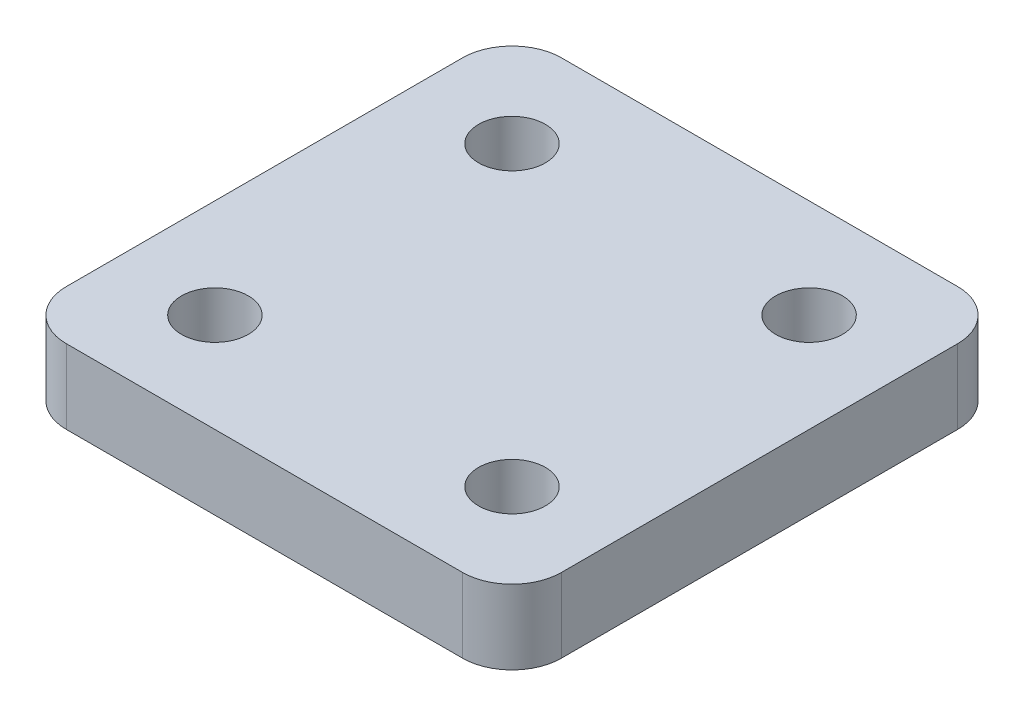
ISO-10303-21;
HEADER;
FILE_DESCRIPTION(('STEP AP214'),'2;1');
FILE_NAME('part.step','',(''),(''),'','','');
FILE_SCHEMA(('AUTOMOTIVE_DESIGN { 1 0 10303 214 1 1 1 1 }'));
ENDSEC;
DATA;
#1=APPLICATION_CONTEXT('core data for automotive mechanical design processes');
#2=APPLICATION_PROTOCOL_DEFINITION('international standard','automotive_design',2000,#1);
#3=PRODUCT_CONTEXT('',#1,'mechanical');
#4=PRODUCT('Part','Part','',(#3));
#5=PRODUCT_RELATED_PRODUCT_CATEGORY('part','',(#4));
#6=PRODUCT_DEFINITION_FORMATION('','',#4);
#7=PRODUCT_DEFINITION_CONTEXT('part definition',#1,'design');
#8=PRODUCT_DEFINITION('design','',#6,#7);
#9=PRODUCT_DEFINITION_SHAPE('','',#8);
#10=(LENGTH_UNIT() NAMED_UNIT(*) SI_UNIT(.MILLI.,.METRE.));
#11=(NAMED_UNIT(*) PLANE_ANGLE_UNIT() SI_UNIT($,.RADIAN.));
#12=(NAMED_UNIT(*) SI_UNIT($,.STERADIAN.) SOLID_ANGLE_UNIT());
#13=UNCERTAINTY_MEASURE_WITH_UNIT(LENGTH_MEASURE(1.E-05),#10,'distance_accuracy_value','');
#14=(GEOMETRIC_REPRESENTATION_CONTEXT(3) GLOBAL_UNCERTAINTY_ASSIGNED_CONTEXT((#13)) GLOBAL_UNIT_ASSIGNED_CONTEXT((#10,
#11,#12)) REPRESENTATION_CONTEXT('',''));
#15=CARTESIAN_POINT('',(0.,0.,0.));
#16=DIRECTION('',(0.,0.,1.));
#17=DIRECTION('',(1.,0.,0.));
#18=AXIS2_PLACEMENT_3D('',#15,#16,#17);
#19=CARTESIAN_POINT('',(0.,3.,0.));
#20=DIRECTION('',(0.,-1.,0.));
#21=DIRECTION('',(0.,0.,1.));
#22=AXIS2_PLACEMENT_3D('',#19,#20,#21);
#23=PLANE('',#22);
#24=DIRECTION('',(0.,0.,-1.));
#25=VECTOR('',#24,1.);
#26=CARTESIAN_POINT('',(-10.,3.,-10.));
#27=LINE('',#26,#25);
#28=CARTESIAN_POINT('',(-9.99999999999999,3.,8.));
#29=VERTEX_POINT('',#28);
#30=CARTESIAN_POINT('',(-10.,3.,-8.));
#31=VERTEX_POINT('',#30);
#32=EDGE_CURVE('E202',#29,#31,#27,.T.);
#33=ORIENTED_EDGE('',*,*,#32,.F.);
#34=CARTESIAN_POINT('',(-7.99999999999999,3.,8.));
#35=DIRECTION('',(0.,1.,0.));
#36=DIRECTION('',(0.,0.,1.));
#37=AXIS2_PLACEMENT_3D('',#34,#35,#36);
#38=CIRCLE('',#37,2.);
#39=CARTESIAN_POINT('',(-7.99999999999999,3.,10.));
#40=VERTEX_POINT('',#39);
#41=EDGE_CURVE('E164',#40,#29,#38,.F.);
#42=ORIENTED_EDGE('',*,*,#41,.F.);
#43=DIRECTION('',(-1.,0.,0.));
#44=VECTOR('',#43,1.);
#45=CARTESIAN_POINT('',(-9.99999999999999,3.,10.));
#46=LINE('',#45,#44);
#47=CARTESIAN_POINT('',(8.,3.,10.));
#48=VERTEX_POINT('',#47);
#49=EDGE_CURVE('E136',#48,#40,#46,.T.);
#50=ORIENTED_EDGE('',*,*,#49,.F.);
#51=CARTESIAN_POINT('',(8.,3.,8.00000000000001));
#52=DIRECTION('',(0.,1.,0.));
#53=DIRECTION('',(0.,0.,1.));
#54=AXIS2_PLACEMENT_3D('',#51,#52,#53);
#55=CIRCLE('',#54,2.);
#56=CARTESIAN_POINT('',(10.,3.,8.));
#57=VERTEX_POINT('',#56);
#58=EDGE_CURVE('E162',#57,#48,#55,.F.);
#59=ORIENTED_EDGE('',*,*,#58,.F.);
#60=DIRECTION('',(0.,0.,1.));
#61=VECTOR('',#60,1.);
#62=CARTESIAN_POINT('',(10.,3.,-10.));
#63=LINE('',#62,#61);
#64=CARTESIAN_POINT('',(10.,3.,-8.));
#65=VERTEX_POINT('',#64);
#66=EDGE_CURVE('E133',#65,#57,#63,.T.);
#67=ORIENTED_EDGE('',*,*,#66,.F.);
#68=CARTESIAN_POINT('',(8.,3.,-8.));
#69=DIRECTION('',(0.,1.,0.));
#70=DIRECTION('',(0.,0.,1.));
#71=AXIS2_PLACEMENT_3D('',#68,#69,#70);
#72=CIRCLE('',#71,2.);
#73=CARTESIAN_POINT('',(8.00000000000001,3.,-10.));
#74=VERTEX_POINT('',#73);
#75=EDGE_CURVE('E159',#74,#65,#72,.F.);
#76=ORIENTED_EDGE('',*,*,#75,.F.);
#77=DIRECTION('',(1.,0.,0.));
#78=VECTOR('',#77,1.);
#79=CARTESIAN_POINT('',(-10.,3.,-10.));
#80=LINE('',#79,#78);
#81=CARTESIAN_POINT('',(-8.,3.,-10.));
#82=VERTEX_POINT('',#81);
#83=EDGE_CURVE('E205',#82,#74,#80,.T.);
#84=ORIENTED_EDGE('',*,*,#83,.F.);
#85=CARTESIAN_POINT('',(-8.,3.,-8.));
#86=DIRECTION('',(0.,1.,0.));
#87=DIRECTION('',(0.,0.,1.));
#88=AXIS2_PLACEMENT_3D('',#85,#86,#87);
#89=CIRCLE('',#88,2.);
#90=EDGE_CURVE('E111',#31,#82,#89,.F.);
#91=ORIENTED_EDGE('',*,*,#90,.F.);
#92=EDGE_LOOP('',(#33,#42,#50,#59,#67,#76,#84,#91));
#93=FACE_BOUND('',#92,.T.);
#94=CARTESIAN_POINT('',(-6.,3.,6.));
#95=DIRECTION('',(0.,-1.,0.));
#96=DIRECTION('',(0.,0.,-1.));
#97=AXIS2_PLACEMENT_3D('',#94,#95,#96);
#98=CIRCLE('',#97,1.35);
#99=CARTESIAN_POINT('',(-6.,3.,4.65));
#100=VERTEX_POINT('',#99);
#101=EDGE_CURVE('E178',#100,#100,#98,.T.);
#102=ORIENTED_EDGE('',*,*,#101,.T.);
#103=EDGE_LOOP('',(#102));
#104=FACE_BOUND('',#103,.T.);
#105=CARTESIAN_POINT('',(6.,3.,6.));
#106=DIRECTION('',(0.,-1.,0.));
#107=DIRECTION('',(0.,0.,1.));
#108=AXIS2_PLACEMENT_3D('',#105,#106,#107);
#109=CIRCLE('',#108,1.35);
#110=CARTESIAN_POINT('',(6.,3.,7.35));
#111=VERTEX_POINT('',#110);
#112=EDGE_CURVE('E193',#111,#111,#109,.T.);
#113=ORIENTED_EDGE('',*,*,#112,.T.);
#114=EDGE_LOOP('',(#113));
#115=FACE_BOUND('',#114,.T.);
#116=CARTESIAN_POINT('',(6.,3.,-6.));
#117=DIRECTION('',(0.,-1.,0.));
#118=DIRECTION('',(0.,0.,-1.));
#119=AXIS2_PLACEMENT_3D('',#116,#117,#118);
#120=CIRCLE('',#119,1.35);
#121=CARTESIAN_POINT('',(6.,3.,-7.35));
#122=VERTEX_POINT('',#121);
#123=EDGE_CURVE('E194',#122,#122,#120,.T.);
#124=ORIENTED_EDGE('',*,*,#123,.T.);
#125=EDGE_LOOP('',(#124));
#126=FACE_BOUND('',#125,.T.);
#127=CARTESIAN_POINT('',(-6.,3.,-6.));
#128=DIRECTION('',(0.,-1.,0.));
#129=DIRECTION('',(0.,0.,1.));
#130=AXIS2_PLACEMENT_3D('',#127,#128,#129);
#131=CIRCLE('',#130,1.35);
#132=CARTESIAN_POINT('',(-6.,3.,-4.65));
#133=VERTEX_POINT('',#132);
#134=EDGE_CURVE('E277',#133,#133,#131,.T.);
#135=ORIENTED_EDGE('',*,*,#134,.T.);
#136=EDGE_LOOP('',(#135));
#137=FACE_BOUND('',#136,.T.);
#138=ADVANCED_FACE('F40',(#93,#104,#115,#126,#137),#23,.F.);
#139=CARTESIAN_POINT('',(0.,0.,0.));
#140=DIRECTION('',(0.,-1.,0.));
#141=DIRECTION('',(0.,0.,1.));
#142=AXIS2_PLACEMENT_3D('',#139,#140,#141);
#143=PLANE('',#142);
#144=CARTESIAN_POINT('',(6.,0.,-6.));
#145=DIRECTION('',(0.,-1.,0.));
#146=DIRECTION('',(0.,0.,-1.));
#147=AXIS2_PLACEMENT_3D('',#144,#145,#146);
#148=CIRCLE('',#147,1.35);
#149=CARTESIAN_POINT('',(6.,0.,-7.35));
#150=VERTEX_POINT('',#149);
#151=EDGE_CURVE('E279',#150,#150,#148,.T.);
#152=ORIENTED_EDGE('',*,*,#151,.F.);
#153=EDGE_LOOP('',(#152));
#154=FACE_BOUND('',#153,.T.);
#155=CARTESIAN_POINT('',(-6.,0.,6.));
#156=DIRECTION('',(0.,-1.,0.));
#157=DIRECTION('',(0.,0.,-1.));
#158=AXIS2_PLACEMENT_3D('',#155,#156,#157);
#159=CIRCLE('',#158,1.35);
#160=CARTESIAN_POINT('',(-6.,0.,4.65));
#161=VERTEX_POINT('',#160);
#162=EDGE_CURVE('E197',#161,#161,#159,.T.);
#163=ORIENTED_EDGE('',*,*,#162,.F.);
#164=EDGE_LOOP('',(#163));
#165=FACE_BOUND('',#164,.T.);
#166=DIRECTION('',(1.,0.,0.));
#167=VECTOR('',#166,1.);
#168=CARTESIAN_POINT('',(-10.,0.,-10.));
#169=LINE('',#168,#167);
#170=CARTESIAN_POINT('',(-8.,0.,-10.));
#171=VERTEX_POINT('',#170);
#172=CARTESIAN_POINT('',(8.00000000000001,0.,-10.));
#173=VERTEX_POINT('',#172);
#174=EDGE_CURVE('E124',#171,#173,#169,.T.);
#175=ORIENTED_EDGE('',*,*,#174,.T.);
#176=CARTESIAN_POINT('',(8.,0.,-8.));
#177=DIRECTION('',(0.,1.,0.));
#178=DIRECTION('',(0.,0.,1.));
#179=AXIS2_PLACEMENT_3D('',#176,#177,#178);
#180=CIRCLE('',#179,2.);
#181=CARTESIAN_POINT('',(10.,0.,-8.));
#182=VERTEX_POINT('',#181);
#183=EDGE_CURVE('E116',#182,#173,#180,.T.);
#184=ORIENTED_EDGE('',*,*,#183,.F.);
#185=DIRECTION('',(0.,0.,1.));
#186=VECTOR('',#185,1.);
#187=CARTESIAN_POINT('',(10.,0.,-10.));
#188=LINE('',#187,#186);
#189=CARTESIAN_POINT('',(10.,0.,8.));
#190=VERTEX_POINT('',#189);
#191=EDGE_CURVE('E174',#182,#190,#188,.T.);
#192=ORIENTED_EDGE('',*,*,#191,.T.);
#193=CARTESIAN_POINT('',(8.,0.,8.00000000000001));
#194=DIRECTION('',(0.,1.,0.));
#195=DIRECTION('',(0.,0.,1.));
#196=AXIS2_PLACEMENT_3D('',#193,#194,#195);
#197=CIRCLE('',#196,2.);
#198=CARTESIAN_POINT('',(8.,0.,10.));
#199=VERTEX_POINT('',#198);
#200=EDGE_CURVE('E180',#199,#190,#197,.T.);
#201=ORIENTED_EDGE('',*,*,#200,.F.);
#202=DIRECTION('',(-1.,0.,0.));
#203=VECTOR('',#202,1.);
#204=CARTESIAN_POINT('',(-9.99999999999999,0.,10.));
#205=LINE('',#204,#203);
#206=CARTESIAN_POINT('',(-7.99999999999999,0.,10.));
#207=VERTEX_POINT('',#206);
#208=EDGE_CURVE('E138',#199,#207,#205,.T.);
#209=ORIENTED_EDGE('',*,*,#208,.T.);
#210=CARTESIAN_POINT('',(-7.99999999999999,0.,8.));
#211=DIRECTION('',(0.,1.,0.));
#212=DIRECTION('',(0.,0.,1.));
#213=AXIS2_PLACEMENT_3D('',#210,#211,#212);
#214=CIRCLE('',#213,2.);
#215=CARTESIAN_POINT('',(-9.99999999999999,0.,8.));
#216=VERTEX_POINT('',#215);
#217=EDGE_CURVE('E129',#216,#207,#214,.T.);
#218=ORIENTED_EDGE('',*,*,#217,.F.);
#219=DIRECTION('',(0.,0.,-1.));
#220=VECTOR('',#219,1.);
#221=CARTESIAN_POINT('',(-10.,0.,-10.));
#222=LINE('',#221,#220);
#223=CARTESIAN_POINT('',(-10.,0.,-8.));
#224=VERTEX_POINT('',#223);
#225=EDGE_CURVE('E127',#216,#224,#222,.T.);
#226=ORIENTED_EDGE('',*,*,#225,.T.);
#227=CARTESIAN_POINT('',(-8.,0.,-8.));
#228=DIRECTION('',(0.,1.,0.));
#229=DIRECTION('',(0.,0.,1.));
#230=AXIS2_PLACEMENT_3D('',#227,#228,#229);
#231=CIRCLE('',#230,2.);
#232=EDGE_CURVE('E108',#171,#224,#231,.T.);
#233=ORIENTED_EDGE('',*,*,#232,.F.);
#234=EDGE_LOOP('',(#175,#184,#192,#201,#209,#218,#226,#233));
#235=FACE_BOUND('',#234,.T.);
#236=CARTESIAN_POINT('',(6.,0.,6.));
#237=DIRECTION('',(0.,-1.,0.));
#238=DIRECTION('',(0.,0.,1.));
#239=AXIS2_PLACEMENT_3D('',#236,#237,#238);
#240=CIRCLE('',#239,1.35);
#241=CARTESIAN_POINT('',(6.,0.,7.35));
#242=VERTEX_POINT('',#241);
#243=EDGE_CURVE('E188',#242,#242,#240,.T.);
#244=ORIENTED_EDGE('',*,*,#243,.F.);
#245=EDGE_LOOP('',(#244));
#246=FACE_BOUND('',#245,.T.);
#247=CARTESIAN_POINT('',(-6.,0.,-6.));
#248=DIRECTION('',(0.,-1.,0.));
#249=DIRECTION('',(0.,0.,1.));
#250=AXIS2_PLACEMENT_3D('',#247,#248,#249);
#251=CIRCLE('',#250,1.35);
#252=CARTESIAN_POINT('',(-6.,0.,-4.65));
#253=VERTEX_POINT('',#252);
#254=EDGE_CURVE('E276',#253,#253,#251,.T.);
#255=ORIENTED_EDGE('',*,*,#254,.F.);
#256=EDGE_LOOP('',(#255));
#257=FACE_BOUND('',#256,.T.);
#258=ADVANCED_FACE('F121',(#154,#165,#235,#246,#257),#143,.T.);
#259=CARTESIAN_POINT('',(10.,3.,-10.));
#260=DIRECTION('',(-1.,0.,0.));
#261=DIRECTION('',(0.,0.,-1.));
#262=AXIS2_PLACEMENT_3D('',#259,#260,#261);
#263=PLANE('',#262);
#264=ORIENTED_EDGE('',*,*,#191,.F.);
#265=DIRECTION('',(0.,-1.,0.));
#266=VECTOR('',#265,1.);
#267=CARTESIAN_POINT('',(10.,3.,-8.));
#268=LINE('',#267,#266);
#269=EDGE_CURVE('E48',#65,#182,#268,.T.);
#270=ORIENTED_EDGE('',*,*,#269,.F.);
#271=ORIENTED_EDGE('',*,*,#66,.T.);
#272=DIRECTION('',(0.,-1.,0.));
#273=VECTOR('',#272,1.);
#274=CARTESIAN_POINT('',(10.,3.,8.));
#275=LINE('',#274,#273);
#276=EDGE_CURVE('E12',#190,#57,#275,.F.);
#277=ORIENTED_EDGE('',*,*,#276,.F.);
#278=EDGE_LOOP('',(#264,#270,#271,#277));
#279=FACE_BOUND('',#278,.T.);
#280=ADVANCED_FACE('F175',(#279),#263,.F.);
#281=CARTESIAN_POINT('',(-9.99999999999999,3.,10.));
#282=DIRECTION('',(0.,0.,-1.));
#283=DIRECTION('',(1.,0.,0.));
#284=AXIS2_PLACEMENT_3D('',#281,#282,#283);
#285=PLANE('',#284);
#286=ORIENTED_EDGE('',*,*,#208,.F.);
#287=DIRECTION('',(0.,-1.,0.));
#288=VECTOR('',#287,1.);
#289=CARTESIAN_POINT('',(8.,3.,10.));
#290=LINE('',#289,#288);
#291=EDGE_CURVE('E62',#48,#199,#290,.T.);
#292=ORIENTED_EDGE('',*,*,#291,.F.);
#293=ORIENTED_EDGE('',*,*,#49,.T.);
#294=DIRECTION('',(0.,-1.,0.));
#295=VECTOR('',#294,1.);
#296=CARTESIAN_POINT('',(-7.99999999999999,3.,10.));
#297=LINE('',#296,#295);
#298=EDGE_CURVE('E55',#207,#40,#297,.F.);
#299=ORIENTED_EDGE('',*,*,#298,.F.);
#300=EDGE_LOOP('',(#286,#292,#293,#299));
#301=FACE_BOUND('',#300,.T.);
#302=ADVANCED_FACE('F210',(#301),#285,.F.);
#303=CARTESIAN_POINT('',(-10.,3.,-10.));
#304=DIRECTION('',(1.,0.,0.));
#305=DIRECTION('',(0.,0.,1.));
#306=AXIS2_PLACEMENT_3D('',#303,#304,#305);
#307=PLANE('',#306);
#308=ORIENTED_EDGE('',*,*,#225,.F.);
#309=DIRECTION('',(0.,-1.,0.));
#310=VECTOR('',#309,1.);
#311=CARTESIAN_POINT('',(-9.99999999999999,3.,8.));
#312=LINE('',#311,#310);
#313=EDGE_CURVE('E128',#29,#216,#312,.T.);
#314=ORIENTED_EDGE('',*,*,#313,.F.);
#315=ORIENTED_EDGE('',*,*,#32,.T.);
#316=DIRECTION('',(0.,-1.,0.));
#317=VECTOR('',#316,1.);
#318=CARTESIAN_POINT('',(-10.,3.,-8.));
#319=LINE('',#318,#317);
#320=EDGE_CURVE('E157',#224,#31,#319,.F.);
#321=ORIENTED_EDGE('',*,*,#320,.F.);
#322=EDGE_LOOP('',(#308,#314,#315,#321));
#323=FACE_BOUND('',#322,.T.);
#324=ADVANCED_FACE('F216',(#323),#307,.F.);
#325=CARTESIAN_POINT('',(-10.,3.,-10.));
#326=DIRECTION('',(0.,0.,1.));
#327=DIRECTION('',(-1.,0.,0.));
#328=AXIS2_PLACEMENT_3D('',#325,#326,#327);
#329=PLANE('',#328);
#330=ORIENTED_EDGE('',*,*,#83,.T.);
#331=DIRECTION('',(0.,-1.,0.));
#332=VECTOR('',#331,1.);
#333=CARTESIAN_POINT('',(8.00000000000001,3.,-10.));
#334=LINE('',#333,#332);
#335=EDGE_CURVE('E117',#173,#74,#334,.F.);
#336=ORIENTED_EDGE('',*,*,#335,.F.);
#337=ORIENTED_EDGE('',*,*,#174,.F.);
#338=DIRECTION('',(0.,-1.,0.));
#339=VECTOR('',#338,1.);
#340=CARTESIAN_POINT('',(-8.,3.,-10.));
#341=LINE('',#340,#339);
#342=EDGE_CURVE('E105',#82,#171,#341,.T.);
#343=ORIENTED_EDGE('',*,*,#342,.F.);
#344=EDGE_LOOP('',(#330,#336,#337,#343));
#345=FACE_BOUND('',#344,.T.);
#346=ADVANCED_FACE('F131',(#345),#329,.F.);
#347=CARTESIAN_POINT('',(-6.,3.,6.));
#348=DIRECTION('',(0.,-1.,0.));
#349=DIRECTION('',(0.,0.,1.));
#350=AXIS2_PLACEMENT_3D('',#347,#348,#349);
#351=CYLINDRICAL_SURFACE('',#350,1.35);
#352=ORIENTED_EDGE('',*,*,#101,.F.);
#353=EDGE_LOOP('',(#352));
#354=FACE_BOUND('',#353,.T.);
#355=ORIENTED_EDGE('',*,*,#162,.T.);
#356=EDGE_LOOP('',(#355));
#357=FACE_BOUND('',#356,.T.);
#358=ADVANCED_FACE('F236',(#354,#357),#351,.F.);
#359=CARTESIAN_POINT('',(6.,3.,6.));
#360=DIRECTION('',(0.,-1.,0.));
#361=DIRECTION('',(0.,0.,1.));
#362=AXIS2_PLACEMENT_3D('',#359,#360,#361);
#363=CYLINDRICAL_SURFACE('',#362,1.35);
#364=ORIENTED_EDGE('',*,*,#112,.F.);
#365=EDGE_LOOP('',(#364));
#366=FACE_BOUND('',#365,.T.);
#367=ORIENTED_EDGE('',*,*,#243,.T.);
#368=EDGE_LOOP('',(#367));
#369=FACE_BOUND('',#368,.T.);
#370=ADVANCED_FACE('F258',(#366,#369),#363,.F.);
#371=CARTESIAN_POINT('',(6.,3.,-6.));
#372=DIRECTION('',(0.,-1.,0.));
#373=DIRECTION('',(0.,0.,1.));
#374=AXIS2_PLACEMENT_3D('',#371,#372,#373);
#375=CYLINDRICAL_SURFACE('',#374,1.35);
#376=ORIENTED_EDGE('',*,*,#123,.F.);
#377=EDGE_LOOP('',(#376));
#378=FACE_BOUND('',#377,.T.);
#379=ORIENTED_EDGE('',*,*,#151,.T.);
#380=EDGE_LOOP('',(#379));
#381=FACE_BOUND('',#380,.T.);
#382=ADVANCED_FACE('F252',(#378,#381),#375,.F.);
#383=CARTESIAN_POINT('',(-6.,3.,-6.));
#384=DIRECTION('',(0.,-1.,0.));
#385=DIRECTION('',(0.,0.,1.));
#386=AXIS2_PLACEMENT_3D('',#383,#384,#385);
#387=CYLINDRICAL_SURFACE('',#386,1.35);
#388=ORIENTED_EDGE('',*,*,#134,.F.);
#389=EDGE_LOOP('',(#388));
#390=FACE_BOUND('',#389,.T.);
#391=ORIENTED_EDGE('',*,*,#254,.T.);
#392=EDGE_LOOP('',(#391));
#393=FACE_BOUND('',#392,.T.);
#394=ADVANCED_FACE('F248',(#390,#393),#387,.F.);
#395=CARTESIAN_POINT('',(-8.,3.,-8.));
#396=DIRECTION('',(0.,-1.,0.));
#397=DIRECTION('',(0.,0.,1.));
#398=AXIS2_PLACEMENT_3D('',#395,#396,#397);
#399=CYLINDRICAL_SURFACE('',#398,2.);
#400=ORIENTED_EDGE('',*,*,#90,.T.);
#401=ORIENTED_EDGE('',*,*,#342,.T.);
#402=ORIENTED_EDGE('',*,*,#232,.T.);
#403=ORIENTED_EDGE('',*,*,#320,.T.);
#404=EDGE_LOOP('',(#400,#401,#402,#403));
#405=FACE_BOUND('',#404,.T.);
#406=ADVANCED_FACE('F107',(#405),#399,.T.);
#407=CARTESIAN_POINT('',(-7.99999999999999,3.,8.));
#408=DIRECTION('',(0.,-1.,0.));
#409=DIRECTION('',(0.,0.,1.));
#410=AXIS2_PLACEMENT_3D('',#407,#408,#409);
#411=CYLINDRICAL_SURFACE('',#410,2.);
#412=ORIENTED_EDGE('',*,*,#41,.T.);
#413=ORIENTED_EDGE('',*,*,#313,.T.);
#414=ORIENTED_EDGE('',*,*,#217,.T.);
#415=ORIENTED_EDGE('',*,*,#298,.T.);
#416=EDGE_LOOP('',(#412,#413,#414,#415));
#417=FACE_BOUND('',#416,.T.);
#418=ADVANCED_FACE('F213',(#417),#411,.T.);
#419=CARTESIAN_POINT('',(8.,3.,8.00000000000001));
#420=DIRECTION('',(0.,-1.,0.));
#421=DIRECTION('',(0.,0.,1.));
#422=AXIS2_PLACEMENT_3D('',#419,#420,#421);
#423=CYLINDRICAL_SURFACE('',#422,2.);
#424=ORIENTED_EDGE('',*,*,#58,.T.);
#425=ORIENTED_EDGE('',*,*,#291,.T.);
#426=ORIENTED_EDGE('',*,*,#200,.T.);
#427=ORIENTED_EDGE('',*,*,#276,.T.);
#428=EDGE_LOOP('',(#424,#425,#426,#427));
#429=FACE_BOUND('',#428,.T.);
#430=ADVANCED_FACE('F221',(#429),#423,.T.);
#431=CARTESIAN_POINT('',(8.,3.,-8.));
#432=DIRECTION('',(0.,-1.,0.));
#433=DIRECTION('',(0.,0.,1.));
#434=AXIS2_PLACEMENT_3D('',#431,#432,#433);
#435=CYLINDRICAL_SURFACE('',#434,2.);
#436=ORIENTED_EDGE('',*,*,#75,.T.);
#437=ORIENTED_EDGE('',*,*,#269,.T.);
#438=ORIENTED_EDGE('',*,*,#183,.T.);
#439=ORIENTED_EDGE('',*,*,#335,.T.);
#440=EDGE_LOOP('',(#436,#437,#438,#439));
#441=FACE_BOUND('',#440,.T.);
#442=ADVANCED_FACE('F42',(#441),#435,.T.);
#443=CLOSED_SHELL('',(#138,#258,#280,#302,#324,#346,#358,#370,#382,#394,#406,#418,#430,#442));
#444=MANIFOLD_SOLID_BREP('B2',#443);
#445=ADVANCED_BREP_SHAPE_REPRESENTATION('',(#18,#444),#14);
#446=SHAPE_DEFINITION_REPRESENTATION(#9,#445);
ENDSEC;
END-ISO-10303-21;
